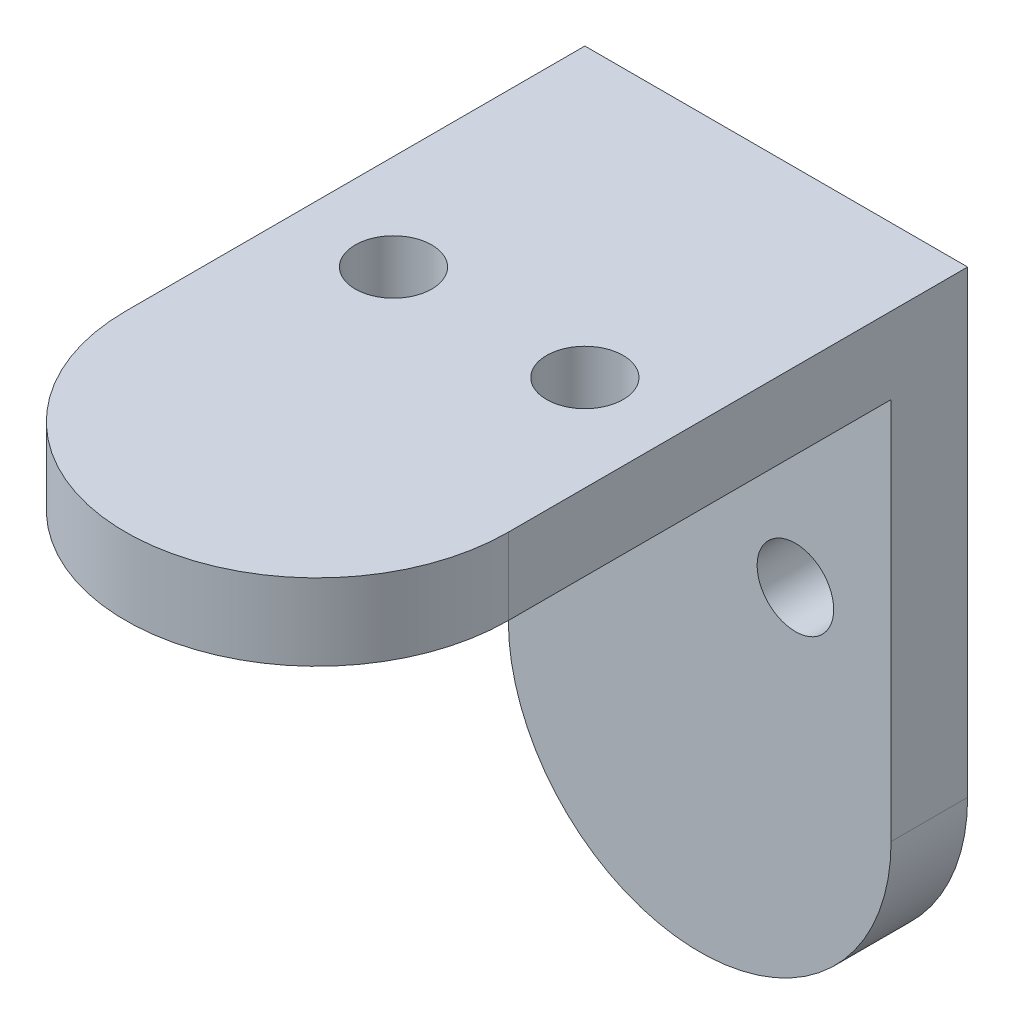
ISO-10303-21;
HEADER;
FILE_DESCRIPTION(('STEP AP214'),'2;1');
FILE_NAME('part.step','',(''),(''),'','','');
FILE_SCHEMA(('AUTOMOTIVE_DESIGN { 1 0 10303 214 1 1 1 1 }'));
ENDSEC;
DATA;
#1=APPLICATION_CONTEXT('core data for automotive mechanical design processes');
#2=APPLICATION_PROTOCOL_DEFINITION('international standard','automotive_design',2000,#1);
#3=PRODUCT_CONTEXT('',#1,'mechanical');
#4=PRODUCT('Part','Part','',(#3));
#5=PRODUCT_RELATED_PRODUCT_CATEGORY('part','',(#4));
#6=PRODUCT_DEFINITION_FORMATION('','',#4);
#7=PRODUCT_DEFINITION_CONTEXT('part definition',#1,'design');
#8=PRODUCT_DEFINITION('design','',#6,#7);
#9=PRODUCT_DEFINITION_SHAPE('','',#8);
#10=(LENGTH_UNIT() NAMED_UNIT(*) SI_UNIT(.MILLI.,.METRE.));
#11=(NAMED_UNIT(*) PLANE_ANGLE_UNIT() SI_UNIT($,.RADIAN.));
#12=(NAMED_UNIT(*) SI_UNIT($,.STERADIAN.) SOLID_ANGLE_UNIT());
#13=UNCERTAINTY_MEASURE_WITH_UNIT(LENGTH_MEASURE(1.E-05),#10,'distance_accuracy_value','');
#14=(GEOMETRIC_REPRESENTATION_CONTEXT(3) GLOBAL_UNCERTAINTY_ASSIGNED_CONTEXT((#13)) GLOBAL_UNIT_ASSIGNED_CONTEXT((#10,
#11,#12)) REPRESENTATION_CONTEXT('',''));
#15=CARTESIAN_POINT('',(0.,0.,0.));
#16=DIRECTION('',(0.,0.,1.));
#17=DIRECTION('',(1.,0.,0.));
#18=AXIS2_PLACEMENT_3D('',#15,#16,#17);
#19=CARTESIAN_POINT('',(0.,-20.,8.));
#20=DIRECTION('',(0.,0.,-1.));
#21=DIRECTION('',(-1.,0.,0.));
#22=AXIS2_PLACEMENT_3D('',#19,#20,#21);
#23=CYLINDRICAL_SURFACE('',#22,20.);
#24=CARTESIAN_POINT('',(0.,-20.,0.));
#25=DIRECTION('',(0.,0.,1.));
#26=DIRECTION('',(1.,0.,0.));
#27=AXIS2_PLACEMENT_3D('',#24,#25,#26);
#28=CIRCLE('',#27,20.);
#29=CARTESIAN_POINT('',(-20.,-20.,0.));
#30=VERTEX_POINT('',#29);
#31=CARTESIAN_POINT('',(20.,-20.,0.));
#32=VERTEX_POINT('',#31);
#33=EDGE_CURVE('E95',#30,#32,#28,.T.);
#34=ORIENTED_EDGE('',*,*,#33,.T.);
#35=DIRECTION('',(0.,0.,-1.));
#36=VECTOR('',#35,1.);
#37=CARTESIAN_POINT('',(20.,-20.,8.));
#38=LINE('',#37,#36);
#39=CARTESIAN_POINT('',(20.,-20.,8.));
#40=VERTEX_POINT('',#39);
#41=EDGE_CURVE('E11',#40,#32,#38,.T.);
#42=ORIENTED_EDGE('',*,*,#41,.F.);
#43=CARTESIAN_POINT('',(0.,-20.,8.));
#44=DIRECTION('',(0.,0.,1.));
#45=DIRECTION('',(1.,0.,0.));
#46=AXIS2_PLACEMENT_3D('',#43,#44,#45);
#47=CIRCLE('',#46,20.);
#48=CARTESIAN_POINT('',(-20.,-20.,8.));
#49=VERTEX_POINT('',#48);
#50=EDGE_CURVE('E87',#49,#40,#47,.T.);
#51=ORIENTED_EDGE('',*,*,#50,.F.);
#52=DIRECTION('',(0.,0.,-1.));
#53=VECTOR('',#52,1.);
#54=CARTESIAN_POINT('',(-20.,-20.,8.));
#55=LINE('',#54,#53);
#56=EDGE_CURVE('E42',#49,#30,#55,.T.);
#57=ORIENTED_EDGE('',*,*,#56,.T.);
#58=EDGE_LOOP('',(#34,#42,#51,#57));
#59=FACE_BOUND('',#58,.T.);
#60=ADVANCED_FACE('F34',(#59),#23,.T.);
#61=CARTESIAN_POINT('',(20.,20.,8.));
#62=DIRECTION('',(-1.,0.,0.));
#63=DIRECTION('',(0.,0.,1.));
#64=AXIS2_PLACEMENT_3D('',#61,#62,#63);
#65=PLANE('',#64);
#66=DIRECTION('',(0.,1.,0.));
#67=VECTOR('',#66,1.);
#68=CARTESIAN_POINT('',(20.,20.,0.));
#69=LINE('',#68,#67);
#70=CARTESIAN_POINT('',(20.,28.,0.));
#71=VERTEX_POINT('',#70);
#72=EDGE_CURVE('E63',#32,#71,#69,.T.);
#73=ORIENTED_EDGE('',*,*,#72,.T.);
#74=DIRECTION('',(0.,0.,-1.));
#75=VECTOR('',#74,1.);
#76=CARTESIAN_POINT('',(20.,28.,0.));
#77=LINE('',#76,#75);
#78=CARTESIAN_POINT('',(20.,28.,48.));
#79=VERTEX_POINT('',#78);
#80=EDGE_CURVE('E119',#79,#71,#77,.T.);
#81=ORIENTED_EDGE('',*,*,#80,.F.);
#82=DIRECTION('',(0.,-1.,0.));
#83=VECTOR('',#82,1.);
#84=CARTESIAN_POINT('',(20.,28.,48.));
#85=LINE('',#84,#83);
#86=CARTESIAN_POINT('',(20.,20.,48.));
#87=VERTEX_POINT('',#86);
#88=EDGE_CURVE('E100',#79,#87,#85,.T.);
#89=ORIENTED_EDGE('',*,*,#88,.T.);
#90=DIRECTION('',(0.,0.,-1.));
#91=VECTOR('',#90,1.);
#92=CARTESIAN_POINT('',(20.,20.,0.));
#93=LINE('',#92,#91);
#94=CARTESIAN_POINT('',(20.,20.,8.));
#95=VERTEX_POINT('',#94);
#96=EDGE_CURVE('E86',#87,#95,#93,.T.);
#97=ORIENTED_EDGE('',*,*,#96,.T.);
#98=DIRECTION('',(0.,1.,0.));
#99=VECTOR('',#98,1.);
#100=CARTESIAN_POINT('',(20.,20.,8.));
#101=LINE('',#100,#99);
#102=EDGE_CURVE('E81',#40,#95,#101,.T.);
#103=ORIENTED_EDGE('',*,*,#102,.F.);
#104=ORIENTED_EDGE('',*,*,#41,.T.);
#105=EDGE_LOOP('',(#73,#81,#89,#97,#103,#104));
#106=FACE_BOUND('',#105,.T.);
#107=ADVANCED_FACE('F82',(#106),#65,.F.);
#108=CARTESIAN_POINT('',(-20.,20.,8.));
#109=DIRECTION('',(1.,0.,0.));
#110=DIRECTION('',(0.,0.,-1.));
#111=AXIS2_PLACEMENT_3D('',#108,#109,#110);
#112=PLANE('',#111);
#113=DIRECTION('',(0.,-1.,0.));
#114=VECTOR('',#113,1.);
#115=CARTESIAN_POINT('',(-20.,20.,0.));
#116=LINE('',#115,#114);
#117=CARTESIAN_POINT('',(-20.,28.,0.));
#118=VERTEX_POINT('',#117);
#119=EDGE_CURVE('E93',#118,#30,#116,.T.);
#120=ORIENTED_EDGE('',*,*,#119,.T.);
#121=ORIENTED_EDGE('',*,*,#56,.F.);
#122=DIRECTION('',(0.,-1.,0.));
#123=VECTOR('',#122,1.);
#124=CARTESIAN_POINT('',(-20.,20.,8.));
#125=LINE('',#124,#123);
#126=CARTESIAN_POINT('',(-20.,20.,8.));
#127=VERTEX_POINT('',#126);
#128=EDGE_CURVE('E50',#127,#49,#125,.T.);
#129=ORIENTED_EDGE('',*,*,#128,.F.);
#130=DIRECTION('',(0.,0.,1.));
#131=VECTOR('',#130,1.);
#132=CARTESIAN_POINT('',(-20.,20.,0.));
#133=LINE('',#132,#131);
#134=CARTESIAN_POINT('',(-20.,20.,48.));
#135=VERTEX_POINT('',#134);
#136=EDGE_CURVE('E113',#127,#135,#133,.T.);
#137=ORIENTED_EDGE('',*,*,#136,.T.);
#138=DIRECTION('',(0.,-1.,0.));
#139=VECTOR('',#138,1.);
#140=CARTESIAN_POINT('',(-20.,28.,48.));
#141=LINE('',#140,#139);
#142=CARTESIAN_POINT('',(-20.,28.,48.));
#143=VERTEX_POINT('',#142);
#144=EDGE_CURVE('E96',#143,#135,#141,.T.);
#145=ORIENTED_EDGE('',*,*,#144,.F.);
#146=DIRECTION('',(0.,0.,1.));
#147=VECTOR('',#146,1.);
#148=CARTESIAN_POINT('',(-20.,28.,0.));
#149=LINE('',#148,#147);
#150=EDGE_CURVE('E109',#118,#143,#149,.T.);
#151=ORIENTED_EDGE('',*,*,#150,.F.);
#152=EDGE_LOOP('',(#120,#121,#129,#137,#145,#151));
#153=FACE_BOUND('',#152,.T.);
#154=ADVANCED_FACE('F170',(#153),#112,.F.);
#155=CARTESIAN_POINT('',(0.,-20.,8.));
#156=DIRECTION('',(0.,0.,1.));
#157=DIRECTION('',(1.,0.,0.));
#158=AXIS2_PLACEMENT_3D('',#155,#156,#157);
#159=PLANE('',#158);
#160=CARTESIAN_POINT('',(10.,-2.,8.));
#161=DIRECTION('',(0.,0.,1.));
#162=DIRECTION('',(1.,0.,0.));
#163=AXIS2_PLACEMENT_3D('',#160,#161,#162);
#164=CIRCLE('',#163,4.);
#165=CARTESIAN_POINT('',(14.,-2.,8.));
#166=VERTEX_POINT('',#165);
#167=EDGE_CURVE('E134',#166,#166,#164,.F.);
#168=ORIENTED_EDGE('',*,*,#167,.T.);
#169=EDGE_LOOP('',(#168));
#170=FACE_BOUND('',#169,.T.);
#171=CARTESIAN_POINT('',(-10.,-2.,8.));
#172=DIRECTION('',(0.,0.,1.));
#173=DIRECTION('',(1.,0.,0.));
#174=AXIS2_PLACEMENT_3D('',#171,#172,#173);
#175=CIRCLE('',#174,4.);
#176=CARTESIAN_POINT('',(-6.00000000000001,-2.,8.));
#177=VERTEX_POINT('',#176);
#178=EDGE_CURVE('E127',#177,#177,#175,.F.);
#179=ORIENTED_EDGE('',*,*,#178,.T.);
#180=EDGE_LOOP('',(#179));
#181=FACE_BOUND('',#180,.T.);
#182=ORIENTED_EDGE('',*,*,#50,.T.);
#183=ORIENTED_EDGE('',*,*,#102,.T.);
#184=DIRECTION('',(-1.,0.,0.));
#185=VECTOR('',#184,1.);
#186=CARTESIAN_POINT('',(-20.,20.,8.));
#187=LINE('',#186,#185);
#188=EDGE_CURVE('E70',#95,#127,#187,.T.);
#189=ORIENTED_EDGE('',*,*,#188,.T.);
#190=ORIENTED_EDGE('',*,*,#128,.T.);
#191=EDGE_LOOP('',(#182,#183,#189,#190));
#192=FACE_BOUND('',#191,.T.);
#193=ADVANCED_FACE('F90',(#170,#181,#192),#159,.T.);
#194=CARTESIAN_POINT('',(0.,-20.,0.));
#195=DIRECTION('',(0.,0.,1.));
#196=DIRECTION('',(1.,0.,0.));
#197=AXIS2_PLACEMENT_3D('',#194,#195,#196);
#198=PLANE('',#197);
#199=CARTESIAN_POINT('',(10.,-2.,0.));
#200=DIRECTION('',(0.,0.,-1.));
#201=DIRECTION('',(-1.,0.,0.));
#202=AXIS2_PLACEMENT_3D('',#199,#200,#201);
#203=CIRCLE('',#202,4.);
#204=CARTESIAN_POINT('',(6.,-2.,0.));
#205=VERTEX_POINT('',#204);
#206=EDGE_CURVE('E116',#205,#205,#203,.T.);
#207=ORIENTED_EDGE('',*,*,#206,.F.);
#208=EDGE_LOOP('',(#207));
#209=FACE_BOUND('',#208,.T.);
#210=CARTESIAN_POINT('',(-10.,-2.,0.));
#211=DIRECTION('',(0.,0.,-1.));
#212=DIRECTION('',(-1.,0.,0.));
#213=AXIS2_PLACEMENT_3D('',#210,#211,#212);
#214=CIRCLE('',#213,4.);
#215=CARTESIAN_POINT('',(-14.,-2.,0.));
#216=VERTEX_POINT('',#215);
#217=EDGE_CURVE('E130',#216,#216,#214,.T.);
#218=ORIENTED_EDGE('',*,*,#217,.F.);
#219=EDGE_LOOP('',(#218));
#220=FACE_BOUND('',#219,.T.);
#221=ORIENTED_EDGE('',*,*,#33,.F.);
#222=ORIENTED_EDGE('',*,*,#119,.F.);
#223=DIRECTION('',(-1.,0.,0.));
#224=VECTOR('',#223,1.);
#225=CARTESIAN_POINT('',(-20.,28.,0.));
#226=LINE('',#225,#224);
#227=EDGE_CURVE('E107',#71,#118,#226,.T.);
#228=ORIENTED_EDGE('',*,*,#227,.F.);
#229=ORIENTED_EDGE('',*,*,#72,.F.);
#230=EDGE_LOOP('',(#221,#222,#228,#229));
#231=FACE_BOUND('',#230,.T.);
#232=ADVANCED_FACE('F177',(#209,#220,#231),#198,.F.);
#233=CARTESIAN_POINT('',(0.,28.,48.));
#234=DIRECTION('',(0.,-1.,0.));
#235=DIRECTION('',(0.,0.,-1.));
#236=AXIS2_PLACEMENT_3D('',#233,#234,#235);
#237=CYLINDRICAL_SURFACE('',#236,20.);
#238=CARTESIAN_POINT('',(0.,20.,48.));
#239=DIRECTION('',(0.,1.,0.));
#240=DIRECTION('',(0.,0.,1.));
#241=AXIS2_PLACEMENT_3D('',#238,#239,#240);
#242=CIRCLE('',#241,20.);
#243=EDGE_CURVE('E110',#135,#87,#242,.T.);
#244=ORIENTED_EDGE('',*,*,#243,.T.);
#245=ORIENTED_EDGE('',*,*,#88,.F.);
#246=CARTESIAN_POINT('',(0.,28.,48.));
#247=DIRECTION('',(0.,1.,0.));
#248=DIRECTION('',(0.,0.,1.));
#249=AXIS2_PLACEMENT_3D('',#246,#247,#248);
#250=CIRCLE('',#249,20.);
#251=EDGE_CURVE('E122',#143,#79,#250,.T.);
#252=ORIENTED_EDGE('',*,*,#251,.F.);
#253=ORIENTED_EDGE('',*,*,#144,.T.);
#254=EDGE_LOOP('',(#244,#245,#252,#253));
#255=FACE_BOUND('',#254,.T.);
#256=ADVANCED_FACE('F158',(#255),#237,.T.);
#257=CARTESIAN_POINT('',(0.,28.,48.));
#258=DIRECTION('',(0.,1.,0.));
#259=DIRECTION('',(0.,0.,1.));
#260=AXIS2_PLACEMENT_3D('',#257,#258,#259);
#261=PLANE('',#260);
#262=CARTESIAN_POINT('',(-10.,28.,30.));
#263=DIRECTION('',(0.,1.,0.));
#264=DIRECTION('',(0.,0.,1.));
#265=AXIS2_PLACEMENT_3D('',#262,#263,#264);
#266=CIRCLE('',#265,4.);
#267=CARTESIAN_POINT('',(-10.,28.,34.));
#268=VERTEX_POINT('',#267);
#269=EDGE_CURVE('E142',#268,#268,#266,.T.);
#270=ORIENTED_EDGE('',*,*,#269,.F.);
#271=EDGE_LOOP('',(#270));
#272=FACE_BOUND('',#271,.T.);
#273=CARTESIAN_POINT('',(10.,28.,30.));
#274=DIRECTION('',(0.,1.,0.));
#275=DIRECTION('',(0.,0.,1.));
#276=AXIS2_PLACEMENT_3D('',#273,#274,#275);
#277=CIRCLE('',#276,4.);
#278=CARTESIAN_POINT('',(10.,28.,34.));
#279=VERTEX_POINT('',#278);
#280=EDGE_CURVE('E143',#279,#279,#277,.T.);
#281=ORIENTED_EDGE('',*,*,#280,.F.);
#282=EDGE_LOOP('',(#281));
#283=FACE_BOUND('',#282,.T.);
#284=ORIENTED_EDGE('',*,*,#150,.T.);
#285=ORIENTED_EDGE('',*,*,#251,.T.);
#286=ORIENTED_EDGE('',*,*,#80,.T.);
#287=ORIENTED_EDGE('',*,*,#227,.T.);
#288=EDGE_LOOP('',(#284,#285,#286,#287));
#289=FACE_BOUND('',#288,.T.);
#290=ADVANCED_FACE('F154',(#272,#283,#289),#261,.T.);
#291=CARTESIAN_POINT('',(0.,20.,48.));
#292=DIRECTION('',(0.,1.,0.));
#293=DIRECTION('',(0.,0.,1.));
#294=AXIS2_PLACEMENT_3D('',#291,#292,#293);
#295=PLANE('',#294);
#296=CARTESIAN_POINT('',(-10.,20.,30.));
#297=DIRECTION('',(0.,1.,0.));
#298=DIRECTION('',(0.,0.,1.));
#299=AXIS2_PLACEMENT_3D('',#296,#297,#298);
#300=CIRCLE('',#299,4.);
#301=CARTESIAN_POINT('',(-10.,20.,34.));
#302=VERTEX_POINT('',#301);
#303=EDGE_CURVE('E131',#302,#302,#300,.F.);
#304=ORIENTED_EDGE('',*,*,#303,.F.);
#305=EDGE_LOOP('',(#304));
#306=FACE_BOUND('',#305,.T.);
#307=CARTESIAN_POINT('',(10.,20.,30.));
#308=DIRECTION('',(0.,1.,0.));
#309=DIRECTION('',(0.,0.,1.));
#310=AXIS2_PLACEMENT_3D('',#307,#308,#309);
#311=CIRCLE('',#310,4.);
#312=CARTESIAN_POINT('',(10.,20.,34.));
#313=VERTEX_POINT('',#312);
#314=EDGE_CURVE('E139',#313,#313,#311,.F.);
#315=ORIENTED_EDGE('',*,*,#314,.F.);
#316=EDGE_LOOP('',(#315));
#317=FACE_BOUND('',#316,.T.);
#318=ORIENTED_EDGE('',*,*,#188,.F.);
#319=ORIENTED_EDGE('',*,*,#96,.F.);
#320=ORIENTED_EDGE('',*,*,#243,.F.);
#321=ORIENTED_EDGE('',*,*,#136,.F.);
#322=EDGE_LOOP('',(#318,#319,#320,#321));
#323=FACE_BOUND('',#322,.T.);
#324=ADVANCED_FACE('F157',(#306,#317,#323),#295,.F.);
#325=CARTESIAN_POINT('',(-10.,-2.,68.001));
#326=DIRECTION('',(0.,0.,-1.));
#327=DIRECTION('',(-1.,0.,0.));
#328=AXIS2_PLACEMENT_3D('',#325,#326,#327);
#329=CYLINDRICAL_SURFACE('',#328,4.);
#330=ORIENTED_EDGE('',*,*,#178,.F.);
#331=EDGE_LOOP('',(#330));
#332=FACE_BOUND('',#331,.T.);
#333=ORIENTED_EDGE('',*,*,#217,.T.);
#334=EDGE_LOOP('',(#333));
#335=FACE_BOUND('',#334,.T.);
#336=ADVANCED_FACE('F218',(#332,#335),#329,.F.);
#337=CARTESIAN_POINT('',(10.,-2.,68.001));
#338=DIRECTION('',(0.,0.,-1.));
#339=DIRECTION('',(-1.,0.,0.));
#340=AXIS2_PLACEMENT_3D('',#337,#338,#339);
#341=CYLINDRICAL_SURFACE('',#340,4.);
#342=ORIENTED_EDGE('',*,*,#167,.F.);
#343=EDGE_LOOP('',(#342));
#344=FACE_BOUND('',#343,.T.);
#345=ORIENTED_EDGE('',*,*,#206,.T.);
#346=EDGE_LOOP('',(#345));
#347=FACE_BOUND('',#346,.T.);
#348=ADVANCED_FACE('F223',(#344,#347),#341,.F.);
#349=CARTESIAN_POINT('',(10.,-40.001,30.));
#350=DIRECTION('',(0.,1.,0.));
#351=DIRECTION('',(0.,0.,1.));
#352=AXIS2_PLACEMENT_3D('',#349,#350,#351);
#353=CYLINDRICAL_SURFACE('',#352,4.);
#354=ORIENTED_EDGE('',*,*,#280,.T.);
#355=EDGE_LOOP('',(#354));
#356=FACE_BOUND('',#355,.T.);
#357=ORIENTED_EDGE('',*,*,#314,.T.);
#358=EDGE_LOOP('',(#357));
#359=FACE_BOUND('',#358,.T.);
#360=ADVANCED_FACE('F235',(#356,#359),#353,.F.);
#361=CARTESIAN_POINT('',(-10.,-40.001,30.));
#362=DIRECTION('',(0.,1.,0.));
#363=DIRECTION('',(0.,0.,1.));
#364=AXIS2_PLACEMENT_3D('',#361,#362,#363);
#365=CYLINDRICAL_SURFACE('',#364,4.);
#366=ORIENTED_EDGE('',*,*,#269,.T.);
#367=EDGE_LOOP('',(#366));
#368=FACE_BOUND('',#367,.T.);
#369=ORIENTED_EDGE('',*,*,#303,.T.);
#370=EDGE_LOOP('',(#369));
#371=FACE_BOUND('',#370,.T.);
#372=ADVANCED_FACE('F151',(#368,#371),#365,.F.);
#373=CLOSED_SHELL('',(#60,#107,#154,#193,#232,#256,#290,#324,#336,#348,#360,#372));
#374=MANIFOLD_SOLID_BREP('B2',#373);
#375=ADVANCED_BREP_SHAPE_REPRESENTATION('',(#18,#374),#14);
#376=SHAPE_DEFINITION_REPRESENTATION(#9,#375);
ENDSEC;
END-ISO-10303-21;
